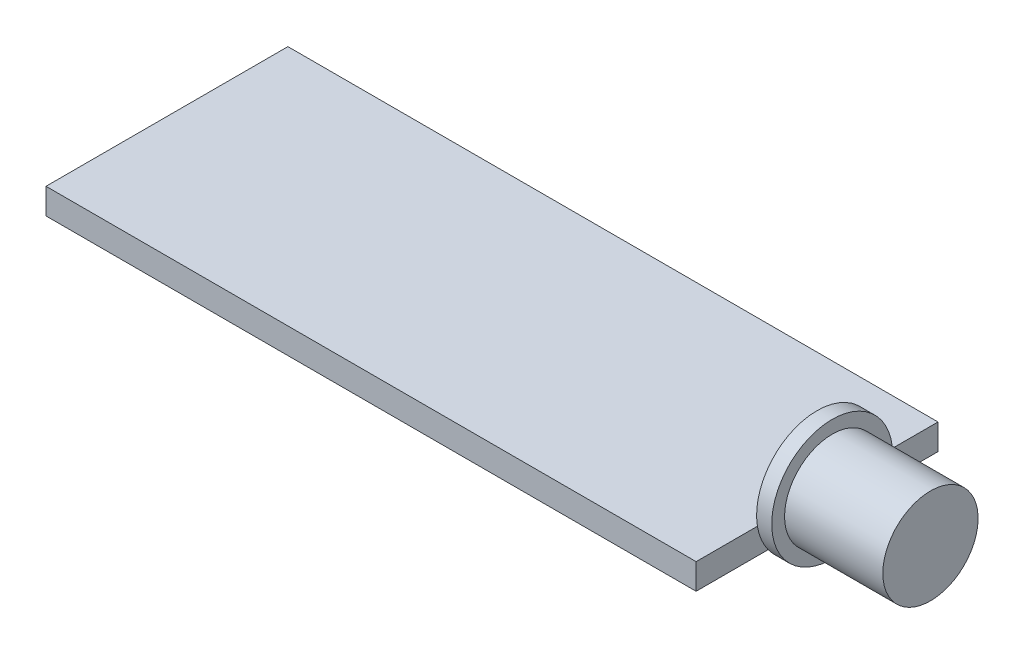
ISO-10303-21;
HEADER;
FILE_DESCRIPTION(('STEP AP214'),'2;1');
FILE_NAME('part.step','',(''),(''),'','','');
FILE_SCHEMA(('AUTOMOTIVE_DESIGN { 1 0 10303 214 1 1 1 1 }'));
ENDSEC;
DATA;
#1=APPLICATION_CONTEXT('core data for automotive mechanical design processes');
#2=APPLICATION_PROTOCOL_DEFINITION('international standard','automotive_design',2000,#1);
#3=PRODUCT_CONTEXT('',#1,'mechanical');
#4=PRODUCT('Part','Part','',(#3));
#5=PRODUCT_RELATED_PRODUCT_CATEGORY('part','',(#4));
#6=PRODUCT_DEFINITION_FORMATION('','',#4);
#7=PRODUCT_DEFINITION_CONTEXT('part definition',#1,'design');
#8=PRODUCT_DEFINITION('design','',#6,#7);
#9=PRODUCT_DEFINITION_SHAPE('','',#8);
#10=(LENGTH_UNIT() NAMED_UNIT(*) SI_UNIT(.MILLI.,.METRE.));
#11=(NAMED_UNIT(*) PLANE_ANGLE_UNIT() SI_UNIT($,.RADIAN.));
#12=(NAMED_UNIT(*) SI_UNIT($,.STERADIAN.) SOLID_ANGLE_UNIT());
#13=UNCERTAINTY_MEASURE_WITH_UNIT(LENGTH_MEASURE(1.E-05),#10,'distance_accuracy_value','');
#14=(GEOMETRIC_REPRESENTATION_CONTEXT(3) GLOBAL_UNCERTAINTY_ASSIGNED_CONTEXT((#13)) GLOBAL_UNIT_ASSIGNED_CONTEXT((#10,
#11,#12)) REPRESENTATION_CONTEXT('',''));
#15=CARTESIAN_POINT('',(0.,0.,0.));
#16=DIRECTION('',(0.,0.,1.));
#17=DIRECTION('',(1.,0.,0.));
#18=AXIS2_PLACEMENT_3D('',#15,#16,#17);
#19=CARTESIAN_POINT('',(44.,2.35,-8.));
#20=DIRECTION('',(1.,0.,0.));
#21=DIRECTION('',(0.,0.,-1.));
#22=AXIS2_PLACEMENT_3D('',#19,#20,#21);
#23=PLANE('',#22);
#24=CARTESIAN_POINT('',(44.,2.35,-8.));
#25=DIRECTION('',(1.,0.,0.));
#26=DIRECTION('',(0.,0.,-1.));
#27=AXIS2_PLACEMENT_3D('',#24,#25,#26);
#28=CIRCLE('',#27,4.);
#29=CARTESIAN_POINT('',(44.,2.35,-12.));
#30=VERTEX_POINT('',#29);
#31=EDGE_CURVE('E116',#30,#30,#28,.T.);
#32=ORIENTED_EDGE('',*,*,#31,.T.);
#33=EDGE_LOOP('',(#32));
#34=FACE_BOUND('',#33,.T.);
#35=CARTESIAN_POINT('',(44.,2.35,-8.));
#36=DIRECTION('',(1.,0.,0.));
#37=DIRECTION('',(0.,0.,-1.));
#38=AXIS2_PLACEMENT_3D('',#35,#36,#37);
#39=CIRCLE('',#38,3.15);
#40=CARTESIAN_POINT('',(44.,2.35,-4.85));
#41=VERTEX_POINT('',#40);
#42=EDGE_CURVE('E255',#41,#41,#39,.T.);
#43=ORIENTED_EDGE('',*,*,#42,.F.);
#44=EDGE_LOOP('',(#43));
#45=FACE_BOUND('',#44,.T.);
#46=ADVANCED_FACE('F37',(#34,#45),#23,.T.);
#47=CARTESIAN_POINT('',(43.,1.7,0.));
#48=DIRECTION('',(-1.,0.,0.));
#49=DIRECTION('',(0.,0.,1.));
#50=AXIS2_PLACEMENT_3D('',#47,#48,#49);
#51=PLANE('',#50);
#52=CARTESIAN_POINT('',(43.,2.35,-8.));
#53=DIRECTION('',(1.,0.,0.));
#54=DIRECTION('',(0.,0.,-1.));
#55=AXIS2_PLACEMENT_3D('',#52,#53,#54);
#56=CIRCLE('',#55,4.);
#57=CARTESIAN_POINT('',(43.,1.7,-4.05316582562682));
#58=VERTEX_POINT('',#57);
#59=CARTESIAN_POINT('',(43.,0.,-4.7631033380721));
#60=VERTEX_POINT('',#59);
#61=EDGE_CURVE('E47',#58,#60,#56,.T.);
#62=ORIENTED_EDGE('',*,*,#61,.F.);
#63=DIRECTION('',(0.,0.,-1.));
#64=VECTOR('',#63,1.);
#65=CARTESIAN_POINT('',(43.,1.7,0.));
#66=LINE('',#65,#64);
#67=CARTESIAN_POINT('',(43.,1.7,0.));
#68=VERTEX_POINT('',#67);
#69=EDGE_CURVE('E97',#68,#58,#66,.T.);
#70=ORIENTED_EDGE('',*,*,#69,.F.);
#71=DIRECTION('',(0.,-1.,0.));
#72=VECTOR('',#71,1.);
#73=CARTESIAN_POINT('',(43.,1.7,0.));
#74=LINE('',#73,#72);
#75=CARTESIAN_POINT('',(43.,0.,0.));
#76=VERTEX_POINT('',#75);
#77=EDGE_CURVE('E139',#68,#76,#74,.T.);
#78=ORIENTED_EDGE('',*,*,#77,.T.);
#79=DIRECTION('',(0.,0.,-1.));
#80=VECTOR('',#79,1.);
#81=CARTESIAN_POINT('',(43.,0.,0.));
#82=LINE('',#81,#80);
#83=EDGE_CURVE('E133',#76,#60,#82,.T.);
#84=ORIENTED_EDGE('',*,*,#83,.T.);
#85=EDGE_LOOP('',(#62,#70,#78,#84));
#86=FACE_BOUND('',#85,.T.);
#87=ADVANCED_FACE('F154',(#86),#51,.F.);
#88=CARTESIAN_POINT('',(43.,0.,-11.2368966619279));
#89=VERTEX_POINT('',#88);
#90=CARTESIAN_POINT('',(43.,1.7,-11.9468341743732));
#91=VERTEX_POINT('',#90);
#92=EDGE_CURVE('E11',#89,#91,#56,.T.);
#93=ORIENTED_EDGE('',*,*,#92,.F.);
#94=CARTESIAN_POINT('',(43.,0.,-16.));
#95=VERTEX_POINT('',#94);
#96=EDGE_CURVE('E132',#89,#95,#82,.T.);
#97=ORIENTED_EDGE('',*,*,#96,.T.);
#98=DIRECTION('',(0.,-1.,0.));
#99=VECTOR('',#98,1.);
#100=CARTESIAN_POINT('',(43.,1.7,-16.));
#101=LINE('',#100,#99);
#102=CARTESIAN_POINT('',(43.,1.7,-16.));
#103=VERTEX_POINT('',#102);
#104=EDGE_CURVE('E104',#103,#95,#101,.T.);
#105=ORIENTED_EDGE('',*,*,#104,.F.);
#106=EDGE_CURVE('E95',#91,#103,#66,.T.);
#107=ORIENTED_EDGE('',*,*,#106,.F.);
#108=EDGE_LOOP('',(#93,#97,#105,#107));
#109=FACE_BOUND('',#108,.T.);
#110=ADVANCED_FACE('F102',(#109),#51,.F.);
#111=CARTESIAN_POINT('',(0.,1.7,0.));
#112=DIRECTION('',(1.,0.,0.));
#113=DIRECTION('',(0.,0.,-1.));
#114=AXIS2_PLACEMENT_3D('',#111,#112,#113);
#115=PLANE('',#114);
#116=DIRECTION('',(0.,0.,1.));
#117=VECTOR('',#116,1.);
#118=CARTESIAN_POINT('',(0.,0.,0.));
#119=LINE('',#118,#117);
#120=CARTESIAN_POINT('',(0.,0.,-16.));
#121=VERTEX_POINT('',#120);
#122=CARTESIAN_POINT('',(0.,0.,0.));
#123=VERTEX_POINT('',#122);
#124=EDGE_CURVE('E127',#121,#123,#119,.T.);
#125=ORIENTED_EDGE('',*,*,#124,.T.);
#126=DIRECTION('',(0.,-1.,0.));
#127=VECTOR('',#126,1.);
#128=CARTESIAN_POINT('',(0.,1.7,0.));
#129=LINE('',#128,#127);
#130=CARTESIAN_POINT('',(0.,1.7,0.));
#131=VERTEX_POINT('',#130);
#132=EDGE_CURVE('E41',#131,#123,#129,.T.);
#133=ORIENTED_EDGE('',*,*,#132,.F.);
#134=DIRECTION('',(0.,0.,1.));
#135=VECTOR('',#134,1.);
#136=CARTESIAN_POINT('',(0.,1.7,0.));
#137=LINE('',#136,#135);
#138=CARTESIAN_POINT('',(0.,1.7,-16.));
#139=VERTEX_POINT('',#138);
#140=EDGE_CURVE('E120',#139,#131,#137,.T.);
#141=ORIENTED_EDGE('',*,*,#140,.F.);
#142=DIRECTION('',(0.,-1.,0.));
#143=VECTOR('',#142,1.);
#144=CARTESIAN_POINT('',(0.,1.7,-16.));
#145=LINE('',#144,#143);
#146=EDGE_CURVE('E126',#139,#121,#145,.T.);
#147=ORIENTED_EDGE('',*,*,#146,.T.);
#148=EDGE_LOOP('',(#125,#133,#141,#147));
#149=FACE_BOUND('',#148,.T.);
#150=ADVANCED_FACE('F39',(#149),#115,.F.);
#151=CARTESIAN_POINT('',(0.,1.7,0.));
#152=DIRECTION('',(0.,0.,-1.));
#153=DIRECTION('',(-1.,0.,0.));
#154=AXIS2_PLACEMENT_3D('',#151,#152,#153);
#155=PLANE('',#154);
#156=DIRECTION('',(1.,0.,0.));
#157=VECTOR('',#156,1.);
#158=CARTESIAN_POINT('',(0.,0.,0.));
#159=LINE('',#158,#157);
#160=EDGE_CURVE('E130',#123,#76,#159,.T.);
#161=ORIENTED_EDGE('',*,*,#160,.T.);
#162=ORIENTED_EDGE('',*,*,#77,.F.);
#163=DIRECTION('',(1.,0.,0.));
#164=VECTOR('',#163,1.);
#165=CARTESIAN_POINT('',(0.,1.7,0.));
#166=LINE('',#165,#164);
#167=EDGE_CURVE('E106',#131,#68,#166,.T.);
#168=ORIENTED_EDGE('',*,*,#167,.F.);
#169=ORIENTED_EDGE('',*,*,#132,.T.);
#170=EDGE_LOOP('',(#161,#162,#168,#169));
#171=FACE_BOUND('',#170,.T.);
#172=ADVANCED_FACE('F146',(#171),#155,.F.);
#173=CARTESIAN_POINT('',(0.,1.7,-16.));
#174=DIRECTION('',(0.,0.,1.));
#175=DIRECTION('',(1.,0.,0.));
#176=AXIS2_PLACEMENT_3D('',#173,#174,#175);
#177=PLANE('',#176);
#178=DIRECTION('',(-1.,0.,0.));
#179=VECTOR('',#178,1.);
#180=CARTESIAN_POINT('',(0.,0.,-16.));
#181=LINE('',#180,#179);
#182=EDGE_CURVE('E122',#95,#121,#181,.T.);
#183=ORIENTED_EDGE('',*,*,#182,.T.);
#184=ORIENTED_EDGE('',*,*,#146,.F.);
#185=DIRECTION('',(-1.,0.,0.));
#186=VECTOR('',#185,1.);
#187=CARTESIAN_POINT('',(0.,1.7,-16.));
#188=LINE('',#187,#186);
#189=EDGE_CURVE('E124',#103,#139,#188,.T.);
#190=ORIENTED_EDGE('',*,*,#189,.F.);
#191=ORIENTED_EDGE('',*,*,#104,.T.);
#192=EDGE_LOOP('',(#183,#184,#190,#191));
#193=FACE_BOUND('',#192,.T.);
#194=ADVANCED_FACE('F164',(#193),#177,.F.);
#195=CARTESIAN_POINT('',(0.,1.7,-16.));
#196=DIRECTION('',(0.,-1.,0.));
#197=DIRECTION('',(0.,0.,-1.));
#198=AXIS2_PLACEMENT_3D('',#195,#196,#197);
#199=PLANE('',#198);
#200=ORIENTED_EDGE('',*,*,#140,.T.);
#201=ORIENTED_EDGE('',*,*,#167,.T.);
#202=ORIENTED_EDGE('',*,*,#69,.T.);
#203=EDGE_CURVE('E92',#58,#91,#66,.T.);
#204=ORIENTED_EDGE('',*,*,#203,.T.);
#205=ORIENTED_EDGE('',*,*,#106,.T.);
#206=ORIENTED_EDGE('',*,*,#189,.T.);
#207=EDGE_LOOP('',(#200,#201,#202,#204,#205,#206));
#208=FACE_BOUND('',#207,.T.);
#209=ADVANCED_FACE('F94',(#208),#199,.F.);
#210=CARTESIAN_POINT('',(0.,0.,-16.));
#211=DIRECTION('',(0.,-1.,0.));
#212=DIRECTION('',(0.,0.,-1.));
#213=AXIS2_PLACEMENT_3D('',#210,#211,#212);
#214=PLANE('',#213);
#215=ORIENTED_EDGE('',*,*,#124,.F.);
#216=ORIENTED_EDGE('',*,*,#182,.F.);
#217=ORIENTED_EDGE('',*,*,#96,.F.);
#218=EDGE_CURVE('E135',#60,#89,#82,.T.);
#219=ORIENTED_EDGE('',*,*,#218,.F.);
#220=ORIENTED_EDGE('',*,*,#83,.F.);
#221=ORIENTED_EDGE('',*,*,#160,.F.);
#222=EDGE_LOOP('',(#215,#216,#217,#219,#220,#221));
#223=FACE_BOUND('',#222,.T.);
#224=ADVANCED_FACE('F153',(#223),#214,.T.);
#225=CARTESIAN_POINT('',(43.,2.35,-8.));
#226=DIRECTION('',(1.,0.,0.));
#227=DIRECTION('',(0.,0.,-1.));
#228=AXIS2_PLACEMENT_3D('',#225,#226,#227);
#229=PLANE('',#228);
#230=EDGE_CURVE('E48',#60,#89,#56,.T.);
#231=ORIENTED_EDGE('',*,*,#230,.F.);
#232=ORIENTED_EDGE('',*,*,#218,.T.);
#233=EDGE_LOOP('',(#231,#232));
#234=FACE_BOUND('',#233,.T.);
#235=ADVANCED_FACE('F200',(#234),#229,.F.);
#236=CARTESIAN_POINT('',(44.,2.35,-8.));
#237=DIRECTION('',(-1.,0.,0.));
#238=DIRECTION('',(0.,0.,1.));
#239=AXIS2_PLACEMENT_3D('',#236,#237,#238);
#240=CYLINDRICAL_SURFACE('',#239,4.);
#241=ORIENTED_EDGE('',*,*,#31,.F.);
#242=EDGE_LOOP('',(#241));
#243=FACE_BOUND('',#242,.T.);
#244=ORIENTED_EDGE('',*,*,#61,.T.);
#245=ORIENTED_EDGE('',*,*,#230,.T.);
#246=ORIENTED_EDGE('',*,*,#92,.T.);
#247=EDGE_CURVE('E107',#91,#58,#56,.T.);
#248=ORIENTED_EDGE('',*,*,#247,.T.);
#249=EDGE_LOOP('',(#244,#245,#246,#248));
#250=FACE_BOUND('',#249,.T.);
#251=ADVANCED_FACE('F112',(#243,#250),#240,.T.);
#252=ORIENTED_EDGE('',*,*,#203,.F.);
#253=ORIENTED_EDGE('',*,*,#247,.F.);
#254=EDGE_LOOP('',(#252,#253));
#255=FACE_BOUND('',#254,.T.);
#256=ADVANCED_FACE('F108',(#255),#229,.F.);
#257=CARTESIAN_POINT('',(50.5,2.35,-8.));
#258=DIRECTION('',(-1.,0.,0.));
#259=DIRECTION('',(0.,0.,1.));
#260=AXIS2_PLACEMENT_3D('',#257,#258,#259);
#261=CYLINDRICAL_SURFACE('',#260,3.15);
#262=CARTESIAN_POINT('',(50.5,2.35,-8.));
#263=DIRECTION('',(1.,0.,0.));
#264=DIRECTION('',(0.,0.,-1.));
#265=AXIS2_PLACEMENT_3D('',#262,#263,#264);
#266=CIRCLE('',#265,3.15);
#267=CARTESIAN_POINT('',(50.5,2.35,-4.85));
#268=VERTEX_POINT('',#267);
#269=EDGE_CURVE('E110',#268,#268,#266,.T.);
#270=CARTESIAN_POINT('',(50.5,2.35,-4.85));
#271=CARTESIAN_POINT('',(50.4322916666667,2.35,-4.85));
#272=CARTESIAN_POINT('',(50.3645833333333,2.35,-4.85));
#273=CARTESIAN_POINT('',(50.2291666666667,2.35,-4.85));
#274=CARTESIAN_POINT('',(50.1614583333333,2.35,-4.85));
#275=CARTESIAN_POINT('',(50.0260416666667,2.35,-4.85));
#276=CARTESIAN_POINT('',(49.9583333333333,2.35,-4.85));
#277=CARTESIAN_POINT('',(49.8229166666667,2.35,-4.85));
#278=CARTESIAN_POINT('',(49.7552083333333,2.35,-4.85));
#279=CARTESIAN_POINT('',(49.6197916666667,2.35,-4.85));
#280=CARTESIAN_POINT('',(49.5520833333333,2.35,-4.85));
#281=CARTESIAN_POINT('',(49.4166666666667,2.35,-4.85));
#282=CARTESIAN_POINT('',(49.3489583333333,2.35,-4.85));
#283=CARTESIAN_POINT('',(49.2135416666667,2.35,-4.85));
#284=CARTESIAN_POINT('',(49.1458333333333,2.35,-4.85));
#285=CARTESIAN_POINT('',(49.0104166666667,2.35,-4.85));
#286=CARTESIAN_POINT('',(48.9427083333333,2.35,-4.85));
#287=CARTESIAN_POINT('',(48.8072916666667,2.35,-4.85));
#288=CARTESIAN_POINT('',(48.7395833333333,2.35,-4.85));
#289=CARTESIAN_POINT('',(48.6041666666667,2.35,-4.85));
#290=CARTESIAN_POINT('',(48.5364583333333,2.35,-4.85));
#291=CARTESIAN_POINT('',(48.4010416666667,2.35,-4.85));
#292=CARTESIAN_POINT('',(48.3333333333333,2.35,-4.85));
#293=CARTESIAN_POINT('',(48.1979166666667,2.35,-4.85));
#294=CARTESIAN_POINT('',(48.1302083333333,2.35,-4.85));
#295=CARTESIAN_POINT('',(47.9947916666667,2.35,-4.85));
#296=CARTESIAN_POINT('',(47.9270833333333,2.35,-4.85));
#297=CARTESIAN_POINT('',(47.7916666666667,2.35,-4.85));
#298=CARTESIAN_POINT('',(47.7239583333333,2.35,-4.85));
#299=CARTESIAN_POINT('',(47.5885416666667,2.35,-4.85));
#300=CARTESIAN_POINT('',(47.5208333333333,2.35,-4.85));
#301=CARTESIAN_POINT('',(47.3854166666667,2.35,-4.85));
#302=CARTESIAN_POINT('',(47.3177083333333,2.35,-4.85));
#303=CARTESIAN_POINT('',(47.1822916666667,2.35,-4.85));
#304=CARTESIAN_POINT('',(47.1145833333333,2.35,-4.85));
#305=CARTESIAN_POINT('',(46.9791666666667,2.35,-4.85));
#306=CARTESIAN_POINT('',(46.9114583333333,2.35,-4.85));
#307=CARTESIAN_POINT('',(46.7760416666667,2.35,-4.85));
#308=CARTESIAN_POINT('',(46.7083333333333,2.35,-4.85));
#309=CARTESIAN_POINT('',(46.5729166666667,2.35,-4.85));
#310=CARTESIAN_POINT('',(46.5052083333333,2.35,-4.85));
#311=CARTESIAN_POINT('',(46.3697916666667,2.35,-4.85));
#312=CARTESIAN_POINT('',(46.3020833333333,2.35,-4.85));
#313=CARTESIAN_POINT('',(46.1666666666667,2.35,-4.85));
#314=CARTESIAN_POINT('',(46.0989583333333,2.35,-4.85));
#315=CARTESIAN_POINT('',(45.9635416666667,2.35,-4.85));
#316=CARTESIAN_POINT('',(45.8958333333333,2.35,-4.85));
#317=CARTESIAN_POINT('',(45.7604166666667,2.35,-4.85));
#318=CARTESIAN_POINT('',(45.6927083333333,2.35,-4.85));
#319=CARTESIAN_POINT('',(45.5572916666667,2.35,-4.85));
#320=CARTESIAN_POINT('',(45.4895833333333,2.35,-4.85));
#321=CARTESIAN_POINT('',(45.3541666666667,2.35,-4.85));
#322=CARTESIAN_POINT('',(45.2864583333333,2.35,-4.85));
#323=CARTESIAN_POINT('',(45.1510416666667,2.35,-4.85));
#324=CARTESIAN_POINT('',(45.0833333333333,2.35,-4.85));
#325=CARTESIAN_POINT('',(44.9479166666667,2.35,-4.85));
#326=CARTESIAN_POINT('',(44.8802083333333,2.35,-4.85));
#327=CARTESIAN_POINT('',(44.7447916666667,2.35,-4.85));
#328=CARTESIAN_POINT('',(44.6770833333333,2.35,-4.85));
#329=CARTESIAN_POINT('',(44.5416666666667,2.35,-4.85));
#330=CARTESIAN_POINT('',(44.4739583333333,2.35,-4.85));
#331=CARTESIAN_POINT('',(44.3385416666667,2.35,-4.85));
#332=CARTESIAN_POINT('',(44.2708333333333,2.35,-4.85));
#333=CARTESIAN_POINT('',(44.1354166666667,2.35,-4.85));
#334=CARTESIAN_POINT('',(44.0677083333333,2.35,-4.85));
#335=CARTESIAN_POINT('',(44.,2.35,-4.85));
#336=B_SPLINE_CURVE_WITH_KNOTS('',3,(#270,#271,#272,#273,#274,#275,#276,#277,#278,#279,#280,
#281,#282,#283,#284,#285,#286,#287,#288,#289,#290,#291,#292,#293,#294,#295,#296,#297,#298,#299,
#300,#301,#302,#303,#304,#305,#306,#307,#308,#309,#310,#311,#312,#313,#314,#315,#316,#317,#318,
#319,#320,#321,#322,#323,#324,#325,#326,#327,#328,#329,#330,#331,#332,#333,#334,#335),
.UNSPECIFIED.,.F.,.F.,(4,2,2,2,2,2,2,2,2,2,2,2,2,2,2,2,2,2,2,2,2,2,2,2,2,2,2,2,2,2,2,2,4),(0.,
0.203125000000005,0.406250000000004,0.609375000000002,0.812500000000001,1.01562500000001,
1.21875,1.421875,1.625,1.82812500000001,2.03125000000001,2.234375,2.4375,2.640625,
2.84375000000001,3.046875,3.25,3.453125,3.65625000000001,3.85937500000001,4.0625,4.265625,
4.46875,4.67187500000001,4.875,5.078125,5.28125,5.48437500000001,5.68750000000001,5.890625,
6.09375,6.296875,6.50000000000001),.UNSPECIFIED.);
#337=EDGE_CURVE('BSEAM225',#268,#41,#336,.T.);
#338=ORIENTED_EDGE('',*,*,#269,.F.);
#339=ORIENTED_EDGE('',*,*,#42,.T.);
#340=ORIENTED_EDGE('',*,*,#337,.T.);
#341=ORIENTED_EDGE('',*,*,#337,.F.);
#342=EDGE_LOOP('',(#338,#340,#339,#341));
#343=FACE_BOUND('',#342,.T.);
#344=ADVANCED_FACE('F225',(#343),#261,.T.);
#345=CARTESIAN_POINT('',(50.5,2.35,-8.));
#346=DIRECTION('',(1.,0.,0.));
#347=DIRECTION('',(0.,0.,-1.));
#348=AXIS2_PLACEMENT_3D('',#345,#346,#347);
#349=PLANE('',#348);
#350=ORIENTED_EDGE('',*,*,#269,.T.);
#351=EDGE_LOOP('',(#350));
#352=FACE_BOUND('',#351,.T.);
#353=ADVANCED_FACE('F239',(#352),#349,.T.);
#354=CLOSED_SHELL('',(#46,#87,#110,#150,#172,#194,#209,#224,#235,#251,#256,#344,#353));
#355=MANIFOLD_SOLID_BREP('B2',#354);
#356=ADVANCED_BREP_SHAPE_REPRESENTATION('',(#18,#355),#14);
#357=SHAPE_DEFINITION_REPRESENTATION(#9,#356);
ENDSEC;
END-ISO-10303-21;
